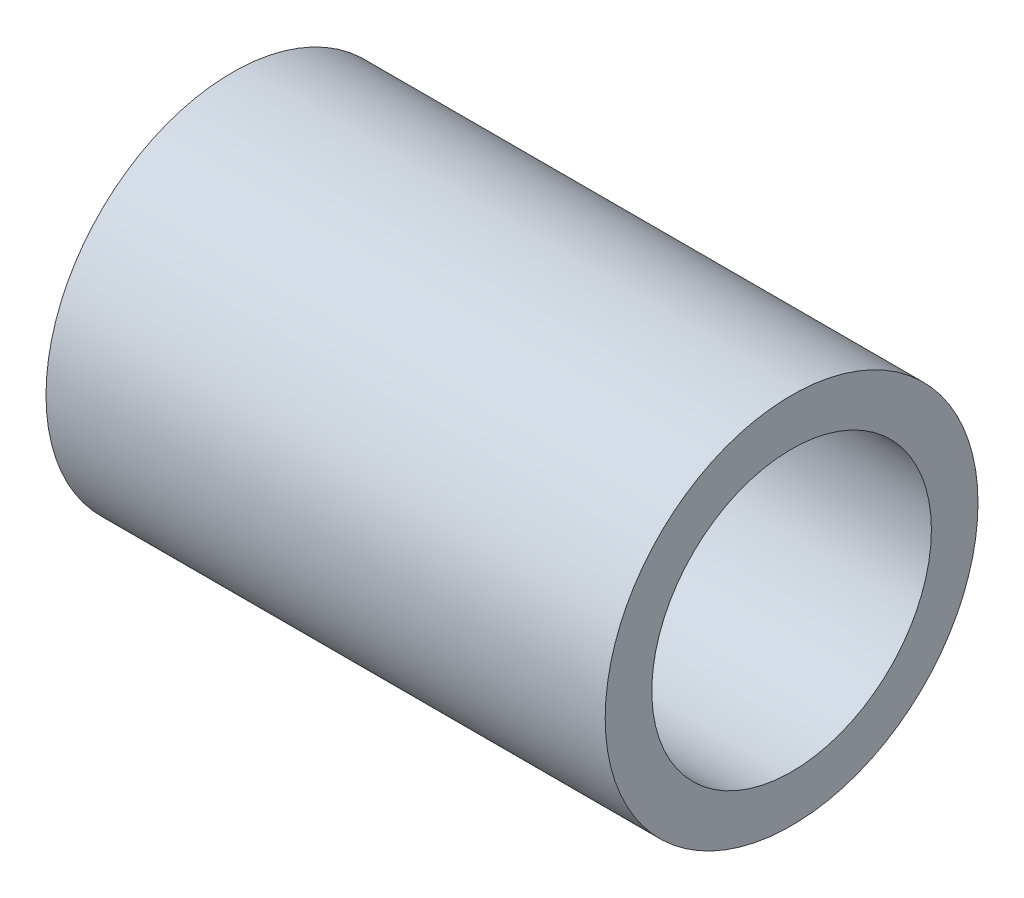
ISO-10303-21;
HEADER;
FILE_DESCRIPTION(('STEP AP214'),'2;1');
FILE_NAME('part.step','',(''),(''),'','','');
FILE_SCHEMA(('AUTOMOTIVE_DESIGN { 1 0 10303 214 1 1 1 1 }'));
ENDSEC;
DATA;
#1=APPLICATION_CONTEXT('core data for automotive mechanical design processes');
#2=APPLICATION_PROTOCOL_DEFINITION('international standard','automotive_design',2000,#1);
#3=PRODUCT_CONTEXT('',#1,'mechanical');
#4=PRODUCT('Part','Part','',(#3));
#5=PRODUCT_RELATED_PRODUCT_CATEGORY('part','',(#4));
#6=PRODUCT_DEFINITION_FORMATION('','',#4);
#7=PRODUCT_DEFINITION_CONTEXT('part definition',#1,'design');
#8=PRODUCT_DEFINITION('design','',#6,#7);
#9=PRODUCT_DEFINITION_SHAPE('','',#8);
#10=(LENGTH_UNIT() NAMED_UNIT(*) SI_UNIT(.MILLI.,.METRE.));
#11=(NAMED_UNIT(*) PLANE_ANGLE_UNIT() SI_UNIT($,.RADIAN.));
#12=(NAMED_UNIT(*) SI_UNIT($,.STERADIAN.) SOLID_ANGLE_UNIT());
#13=UNCERTAINTY_MEASURE_WITH_UNIT(LENGTH_MEASURE(1.E-05),#10,'distance_accuracy_value','');
#14=(GEOMETRIC_REPRESENTATION_CONTEXT(3) GLOBAL_UNCERTAINTY_ASSIGNED_CONTEXT((#13)) GLOBAL_UNIT_ASSIGNED_CONTEXT((#10,
#11,#12)) REPRESENTATION_CONTEXT('',''));
#15=CARTESIAN_POINT('',(0.,0.,0.));
#16=DIRECTION('',(0.,0.,1.));
#17=DIRECTION('',(1.,0.,0.));
#18=AXIS2_PLACEMENT_3D('',#15,#16,#17);
#19=CARTESIAN_POINT('',(6.,0.,0.));
#20=DIRECTION('',(1.,0.,0.));
#21=DIRECTION('',(0.,0.,-1.));
#22=AXIS2_PLACEMENT_3D('',#19,#20,#21);
#23=PLANE('',#22);
#24=CARTESIAN_POINT('',(6.,0.,0.));
#25=DIRECTION('',(1.,0.,0.));
#26=DIRECTION('',(0.,0.,-1.));
#27=AXIS2_PLACEMENT_3D('',#24,#25,#26);
#28=CIRCLE('',#27,2.);
#29=CARTESIAN_POINT('',(6.,0.,-2.));
#30=VERTEX_POINT('',#29);
#31=EDGE_CURVE('E10',#30,#30,#28,.T.);
#32=ORIENTED_EDGE('',*,*,#31,.T.);
#33=EDGE_LOOP('',(#32));
#34=FACE_BOUND('',#33,.T.);
#35=CARTESIAN_POINT('',(6.,0.,0.));
#36=DIRECTION('',(1.,0.,0.));
#37=DIRECTION('',(0.,0.,-1.));
#38=AXIS2_PLACEMENT_3D('',#35,#36,#37);
#39=CIRCLE('',#38,1.5);
#40=CARTESIAN_POINT('',(6.,0.,-1.5));
#41=VERTEX_POINT('',#40);
#42=EDGE_CURVE('E48',#41,#41,#39,.T.);
#43=ORIENTED_EDGE('',*,*,#42,.F.);
#44=EDGE_LOOP('',(#43));
#45=FACE_BOUND('',#44,.T.);
#46=ADVANCED_FACE('F37',(#34,#45),#23,.T.);
#47=CARTESIAN_POINT('',(0.,0.,0.));
#48=DIRECTION('',(1.,0.,0.));
#49=DIRECTION('',(0.,0.,-1.));
#50=AXIS2_PLACEMENT_3D('',#47,#48,#49);
#51=PLANE('',#50);
#52=CARTESIAN_POINT('',(0.,0.,0.));
#53=DIRECTION('',(1.,0.,0.));
#54=DIRECTION('',(0.,0.,-1.));
#55=AXIS2_PLACEMENT_3D('',#52,#53,#54);
#56=CIRCLE('',#55,2.);
#57=CARTESIAN_POINT('',(0.,0.,-2.));
#58=VERTEX_POINT('',#57);
#59=EDGE_CURVE('E41',#58,#58,#56,.T.);
#60=ORIENTED_EDGE('',*,*,#59,.F.);
#61=EDGE_LOOP('',(#60));
#62=FACE_BOUND('',#61,.T.);
#63=CARTESIAN_POINT('',(0.,0.,0.));
#64=DIRECTION('',(1.,0.,0.));
#65=DIRECTION('',(0.,0.,-1.));
#66=AXIS2_PLACEMENT_3D('',#63,#64,#65);
#67=CIRCLE('',#66,1.5);
#68=CARTESIAN_POINT('',(0.,0.,-1.5));
#69=VERTEX_POINT('',#68);
#70=EDGE_CURVE('E50',#69,#69,#67,.T.);
#71=ORIENTED_EDGE('',*,*,#70,.T.);
#72=EDGE_LOOP('',(#71));
#73=FACE_BOUND('',#72,.T.);
#74=ADVANCED_FACE('F60',(#62,#73),#51,.F.);
#75=CARTESIAN_POINT('',(6.,0.,0.));
#76=DIRECTION('',(-1.,0.,0.));
#77=DIRECTION('',(0.,0.,1.));
#78=AXIS2_PLACEMENT_3D('',#75,#76,#77);
#79=CYLINDRICAL_SURFACE('',#78,2.);
#80=ORIENTED_EDGE('',*,*,#31,.F.);
#81=EDGE_LOOP('',(#80));
#82=FACE_BOUND('',#81,.T.);
#83=ORIENTED_EDGE('',*,*,#59,.T.);
#84=EDGE_LOOP('',(#83));
#85=FACE_BOUND('',#84,.T.);
#86=ADVANCED_FACE('F39',(#82,#85),#79,.T.);
#87=CARTESIAN_POINT('',(6.,0.,0.));
#88=DIRECTION('',(-1.,0.,0.));
#89=DIRECTION('',(0.,0.,1.));
#90=AXIS2_PLACEMENT_3D('',#87,#88,#89);
#91=CYLINDRICAL_SURFACE('',#90,1.5);
#92=ORIENTED_EDGE('',*,*,#42,.T.);
#93=EDGE_LOOP('',(#92));
#94=FACE_BOUND('',#93,.T.);
#95=ORIENTED_EDGE('',*,*,#70,.F.);
#96=EDGE_LOOP('',(#95));
#97=FACE_BOUND('',#96,.T.);
#98=ADVANCED_FACE('F56',(#94,#97),#91,.F.);
#99=CLOSED_SHELL('',(#46,#74,#86,#98));
#100=MANIFOLD_SOLID_BREP('B2',#99);
#101=ADVANCED_BREP_SHAPE_REPRESENTATION('',(#18,#100),#14);
#102=SHAPE_DEFINITION_REPRESENTATION(#9,#101);
ENDSEC;
END-ISO-10303-21;
